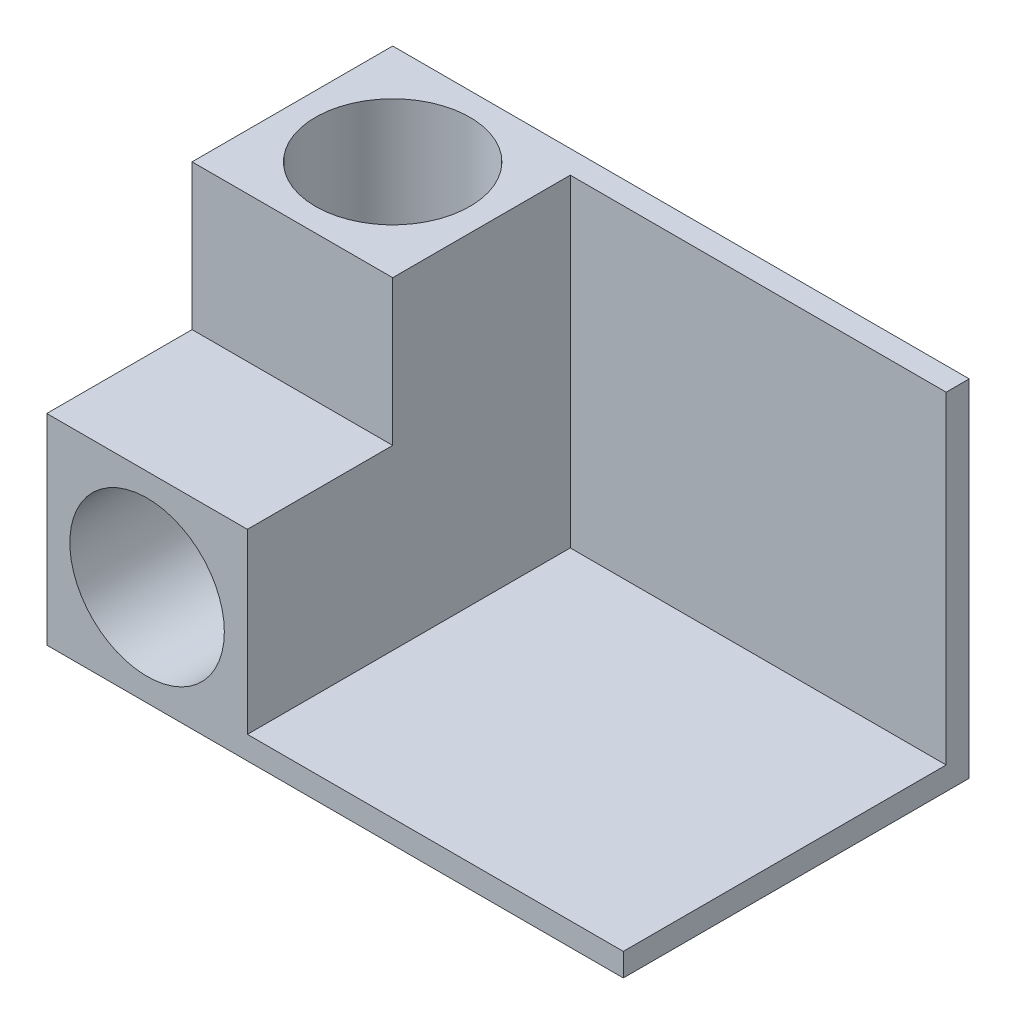
ISO-10303-21;
HEADER;
FILE_DESCRIPTION(('STEP AP214'),'2;1');
FILE_NAME('part.step','',(''),(''),'','','');
FILE_SCHEMA(('AUTOMOTIVE_DESIGN { 1 0 10303 214 1 1 1 1 }'));
ENDSEC;
DATA;
#1=APPLICATION_CONTEXT('core data for automotive mechanical design processes');
#2=APPLICATION_PROTOCOL_DEFINITION('international standard','automotive_design',2000,#1);
#3=PRODUCT_CONTEXT('',#1,'mechanical');
#4=PRODUCT('Part','Part','',(#3));
#5=PRODUCT_RELATED_PRODUCT_CATEGORY('part','',(#4));
#6=PRODUCT_DEFINITION_FORMATION('','',#4);
#7=PRODUCT_DEFINITION_CONTEXT('part definition',#1,'design');
#8=PRODUCT_DEFINITION('design','',#6,#7);
#9=PRODUCT_DEFINITION_SHAPE('','',#8);
#10=(LENGTH_UNIT() NAMED_UNIT(*) SI_UNIT(.MILLI.,.METRE.));
#11=(NAMED_UNIT(*) PLANE_ANGLE_UNIT() SI_UNIT($,.RADIAN.));
#12=(NAMED_UNIT(*) SI_UNIT($,.STERADIAN.) SOLID_ANGLE_UNIT());
#13=UNCERTAINTY_MEASURE_WITH_UNIT(LENGTH_MEASURE(1.E-05),#10,'distance_accuracy_value','');
#14=(GEOMETRIC_REPRESENTATION_CONTEXT(3) GLOBAL_UNCERTAINTY_ASSIGNED_CONTEXT((#13)) GLOBAL_UNIT_ASSIGNED_CONTEXT((#10,
#11,#12)) REPRESENTATION_CONTEXT('',''));
#15=CARTESIAN_POINT('',(0.,0.,0.));
#16=DIRECTION('',(0.,0.,1.));
#17=DIRECTION('',(1.,0.,0.));
#18=AXIS2_PLACEMENT_3D('',#15,#16,#17);
#19=CARTESIAN_POINT('',(-65.2,56.,0.));
#20=DIRECTION('',(1.,0.,0.));
#21=DIRECTION('',(0.,0.,-1.));
#22=AXIS2_PLACEMENT_3D('',#19,#20,#21);
#23=PLANE('',#22);
#24=DIRECTION('',(0.,0.,-1.));
#25=VECTOR('',#24,1.);
#26=CARTESIAN_POINT('',(-65.2,30.8,0.));
#27=LINE('',#26,#25);
#28=CARTESIAN_POINT('',(-65.2,30.8,11.3201320132013));
#29=VERTEX_POINT('',#28);
#30=CARTESIAN_POINT('',(-65.2,30.8,-13.8798679867987));
#31=VERTEX_POINT('',#30);
#32=EDGE_CURVE('E154',#29,#31,#27,.T.);
#33=ORIENTED_EDGE('',*,*,#32,.F.);
#34=DIRECTION('',(0.,-1.,0.));
#35=VECTOR('',#34,1.);
#36=CARTESIAN_POINT('',(-65.2,56.,11.3201320132013));
#37=LINE('',#36,#35);
#38=CARTESIAN_POINT('',(-65.2,0.,11.3201320132013));
#39=VERTEX_POINT('',#38);
#40=EDGE_CURVE('E119',#29,#39,#37,.T.);
#41=ORIENTED_EDGE('',*,*,#40,.T.);
#42=DIRECTION('',(0.,0.,1.));
#43=VECTOR('',#42,1.);
#44=CARTESIAN_POINT('',(-65.2,0.,0.));
#45=LINE('',#44,#43);
#46=CARTESIAN_POINT('',(-65.2,0.,-44.6798679867987));
#47=VERTEX_POINT('',#46);
#48=EDGE_CURVE('E123',#47,#39,#45,.T.);
#49=ORIENTED_EDGE('',*,*,#48,.F.);
#50=DIRECTION('',(0.,-1.,0.));
#51=VECTOR('',#50,1.);
#52=CARTESIAN_POINT('',(-65.2,56.,-44.6798679867987));
#53=LINE('',#52,#51);
#54=CARTESIAN_POINT('',(-65.2,56.,-44.6798679867987));
#55=VERTEX_POINT('',#54);
#56=EDGE_CURVE('E43',#55,#47,#53,.T.);
#57=ORIENTED_EDGE('',*,*,#56,.F.);
#58=DIRECTION('',(0.,0.,1.));
#59=VECTOR('',#58,1.);
#60=CARTESIAN_POINT('',(-65.2,56.,0.));
#61=LINE('',#60,#59);
#62=CARTESIAN_POINT('',(-65.2,56.,-13.8798679867987));
#63=VERTEX_POINT('',#62);
#64=EDGE_CURVE('E107',#55,#63,#61,.T.);
#65=ORIENTED_EDGE('',*,*,#64,.T.);
#66=DIRECTION('',(0.,1.,0.));
#67=VECTOR('',#66,1.);
#68=CARTESIAN_POINT('',(-65.2,56.,-13.8798679867987));
#69=LINE('',#68,#67);
#70=EDGE_CURVE('E49',#31,#63,#69,.T.);
#71=ORIENTED_EDGE('',*,*,#70,.F.);
#72=EDGE_LOOP('',(#33,#41,#49,#57,#65,#71));
#73=FACE_BOUND('',#72,.T.);
#74=ADVANCED_FACE('F35',(#73),#23,.T.);
#75=CARTESIAN_POINT('',(0.,56.,-44.6798679867987));
#76=DIRECTION('',(0.,0.,-1.));
#77=DIRECTION('',(-1.,0.,0.));
#78=AXIS2_PLACEMENT_3D('',#75,#76,#77);
#79=PLANE('',#78);
#80=DIRECTION('',(1.,0.,0.));
#81=VECTOR('',#80,1.);
#82=CARTESIAN_POINT('',(0.,0.,-44.6798679867987));
#83=LINE('',#82,#81);
#84=CARTESIAN_POINT('',(0.,0.,-44.6798679867987));
#85=VERTEX_POINT('',#84);
#86=EDGE_CURVE('E80',#47,#85,#83,.T.);
#87=ORIENTED_EDGE('',*,*,#86,.T.);
#88=DIRECTION('',(0.,-1.,0.));
#89=VECTOR('',#88,1.);
#90=CARTESIAN_POINT('',(0.,56.,-44.6798679867987));
#91=LINE('',#90,#89);
#92=CARTESIAN_POINT('',(0.,56.,-44.6798679867987));
#93=VERTEX_POINT('',#92);
#94=EDGE_CURVE('E94',#93,#85,#91,.T.);
#95=ORIENTED_EDGE('',*,*,#94,.F.);
#96=DIRECTION('',(1.,0.,0.));
#97=VECTOR('',#96,1.);
#98=CARTESIAN_POINT('',(0.,56.,-44.6798679867987));
#99=LINE('',#98,#97);
#100=EDGE_CURVE('E100',#55,#93,#99,.T.);
#101=ORIENTED_EDGE('',*,*,#100,.F.);
#102=ORIENTED_EDGE('',*,*,#56,.T.);
#103=EDGE_LOOP('',(#87,#95,#101,#102));
#104=FACE_BOUND('',#103,.T.);
#105=ADVANCED_FACE('F110',(#104),#79,.F.);
#106=CARTESIAN_POINT('',(0.,56.,0.));
#107=DIRECTION('',(-1.,0.,0.));
#108=DIRECTION('',(0.,0.,1.));
#109=AXIS2_PLACEMENT_3D('',#106,#107,#108);
#110=PLANE('',#109);
#111=ORIENTED_EDGE('',*,*,#94,.T.);
#112=DIRECTION('',(0.,0.,-1.));
#113=VECTOR('',#112,1.);
#114=CARTESIAN_POINT('',(0.,0.,-48.6798679867987));
#115=LINE('',#114,#113);
#116=CARTESIAN_POINT('',(0.,0.,11.3201320132013));
#117=VERTEX_POINT('',#116);
#118=EDGE_CURVE('E72',#117,#85,#115,.T.);
#119=ORIENTED_EDGE('',*,*,#118,.F.);
#120=DIRECTION('',(0.,1.,0.));
#121=VECTOR('',#120,1.);
#122=CARTESIAN_POINT('',(0.,-4.,11.3201320132013));
#123=LINE('',#122,#121);
#124=CARTESIAN_POINT('',(0.,-4.,11.3201320132013));
#125=VERTEX_POINT('',#124);
#126=EDGE_CURVE('E128',#125,#117,#123,.T.);
#127=ORIENTED_EDGE('',*,*,#126,.F.);
#128=DIRECTION('',(0.,0.,-1.));
#129=VECTOR('',#128,1.);
#130=CARTESIAN_POINT('',(0.,-4.,-48.6798679867987));
#131=LINE('',#130,#129);
#132=CARTESIAN_POINT('',(0.,-4.,-48.6798679867987));
#133=VERTEX_POINT('',#132);
#134=EDGE_CURVE('E139',#125,#133,#131,.T.);
#135=ORIENTED_EDGE('',*,*,#134,.T.);
#136=DIRECTION('',(0.,-1.,0.));
#137=VECTOR('',#136,1.);
#138=CARTESIAN_POINT('',(0.,56.,-48.6798679867987));
#139=LINE('',#138,#137);
#140=CARTESIAN_POINT('',(0.,56.,-48.6798679867987));
#141=VERTEX_POINT('',#140);
#142=EDGE_CURVE('E97',#141,#133,#139,.T.);
#143=ORIENTED_EDGE('',*,*,#142,.F.);
#144=DIRECTION('',(0.,0.,-1.));
#145=VECTOR('',#144,1.);
#146=CARTESIAN_POINT('',(0.,56.,0.));
#147=LINE('',#146,#145);
#148=EDGE_CURVE('E90',#93,#141,#147,.T.);
#149=ORIENTED_EDGE('',*,*,#148,.F.);
#150=EDGE_LOOP('',(#111,#119,#127,#135,#143,#149));
#151=FACE_BOUND('',#150,.T.);
#152=ADVANCED_FACE('F92',(#151),#110,.F.);
#153=CARTESIAN_POINT('',(0.,56.,-48.6798679867987));
#154=DIRECTION('',(0.,0.,1.));
#155=DIRECTION('',(1.,0.,0.));
#156=AXIS2_PLACEMENT_3D('',#153,#154,#155);
#157=PLANE('',#156);
#158=ORIENTED_EDGE('',*,*,#142,.T.);
#159=DIRECTION('',(-1.,0.,0.));
#160=VECTOR('',#159,1.);
#161=CARTESIAN_POINT('',(0.,-4.,-48.6798679867987));
#162=LINE('',#161,#160);
#163=CARTESIAN_POINT('',(-100.,-4.,-48.6798679867987));
#164=VERTEX_POINT('',#163);
#165=EDGE_CURVE('E147',#133,#164,#162,.T.);
#166=ORIENTED_EDGE('',*,*,#165,.T.);
#167=DIRECTION('',(0.,-1.,0.));
#168=VECTOR('',#167,1.);
#169=CARTESIAN_POINT('',(-100.,56.,-48.6798679867987));
#170=LINE('',#169,#168);
#171=CARTESIAN_POINT('',(-100.,56.,-48.6798679867987));
#172=VERTEX_POINT('',#171);
#173=EDGE_CURVE('E112',#172,#164,#170,.T.);
#174=ORIENTED_EDGE('',*,*,#173,.F.);
#175=DIRECTION('',(-1.,0.,0.));
#176=VECTOR('',#175,1.);
#177=CARTESIAN_POINT('',(0.,56.,-48.6798679867987));
#178=LINE('',#177,#176);
#179=EDGE_CURVE('E99',#141,#172,#178,.T.);
#180=ORIENTED_EDGE('',*,*,#179,.F.);
#181=EDGE_LOOP('',(#158,#166,#174,#180));
#182=FACE_BOUND('',#181,.T.);
#183=ADVANCED_FACE('F210',(#182),#157,.F.);
#184=CARTESIAN_POINT('',(-100.,56.,0.));
#185=DIRECTION('',(-1.,0.,0.));
#186=DIRECTION('',(0.,0.,1.));
#187=AXIS2_PLACEMENT_3D('',#184,#185,#186);
#188=PLANE('',#187);
#189=DIRECTION('',(0.,0.,1.));
#190=VECTOR('',#189,1.);
#191=CARTESIAN_POINT('',(-100.,30.8,11.3201320132013));
#192=LINE('',#191,#190);
#193=CARTESIAN_POINT('',(-100.,30.8,-13.8798679867987));
#194=VERTEX_POINT('',#193);
#195=CARTESIAN_POINT('',(-100.,30.8,11.3201320132013));
#196=VERTEX_POINT('',#195);
#197=EDGE_CURVE('E164',#194,#196,#192,.T.);
#198=ORIENTED_EDGE('',*,*,#197,.F.);
#199=DIRECTION('',(0.,-1.,0.));
#200=VECTOR('',#199,1.);
#201=CARTESIAN_POINT('',(-100.,56.,-13.8798679867987));
#202=LINE('',#201,#200);
#203=CARTESIAN_POINT('',(-100.,56.,-13.8798679867987));
#204=VERTEX_POINT('',#203);
#205=EDGE_CURVE('E169',#204,#194,#202,.T.);
#206=ORIENTED_EDGE('',*,*,#205,.F.);
#207=DIRECTION('',(0.,0.,-1.));
#208=VECTOR('',#207,1.);
#209=CARTESIAN_POINT('',(-100.,56.,0.));
#210=LINE('',#209,#208);
#211=EDGE_CURVE('E58',#204,#172,#210,.T.);
#212=ORIENTED_EDGE('',*,*,#211,.T.);
#213=ORIENTED_EDGE('',*,*,#173,.T.);
#214=DIRECTION('',(0.,0.,1.));
#215=VECTOR('',#214,1.);
#216=CARTESIAN_POINT('',(-100.,-4.,-48.6798679867987));
#217=LINE('',#216,#215);
#218=CARTESIAN_POINT('',(-100.,-4.,11.3201320132013));
#219=VERTEX_POINT('',#218);
#220=EDGE_CURVE('E144',#164,#219,#217,.T.);
#221=ORIENTED_EDGE('',*,*,#220,.T.);
#222=DIRECTION('',(0.,-1.,0.));
#223=VECTOR('',#222,1.);
#224=CARTESIAN_POINT('',(-100.,56.,11.3201320132013));
#225=LINE('',#224,#223);
#226=EDGE_CURVE('E116',#196,#219,#225,.T.);
#227=ORIENTED_EDGE('',*,*,#226,.F.);
#228=EDGE_LOOP('',(#198,#206,#212,#213,#221,#227));
#229=FACE_BOUND('',#228,.T.);
#230=ADVANCED_FACE('F179',(#229),#188,.T.);
#231=CARTESIAN_POINT('',(-82.6,56.,-31.2798679867987));
#232=DIRECTION('',(0.,-1.,0.));
#233=DIRECTION('',(0.,0.,-1.));
#234=AXIS2_PLACEMENT_3D('',#231,#232,#233);
#235=CYLINDRICAL_SURFACE('',#234,13.4);
#236=CARTESIAN_POINT('',(-82.6,56.,-31.2798679867987));
#237=DIRECTION('',(0.,1.,0.));
#238=DIRECTION('',(0.,0.,1.));
#239=AXIS2_PLACEMENT_3D('',#236,#237,#238);
#240=CIRCLE('',#239,13.4);
#241=CARTESIAN_POINT('',(-82.6,56.,-17.8798679867987));
#242=VERTEX_POINT('',#241);
#243=EDGE_CURVE('E122',#242,#242,#240,.T.);
#244=ORIENTED_EDGE('',*,*,#243,.T.);
#245=EDGE_LOOP('',(#244));
#246=FACE_BOUND('',#245,.T.);
#247=CARTESIAN_POINT('',(-82.6,0.,-31.2798679867987));
#248=DIRECTION('',(0.,1.,0.));
#249=DIRECTION('',(0.,0.,1.));
#250=AXIS2_PLACEMENT_3D('',#247,#248,#249);
#251=CIRCLE('',#250,13.4);
#252=CARTESIAN_POINT('',(-82.6,0.,-17.8798679867987));
#253=VERTEX_POINT('',#252);
#254=EDGE_CURVE('E125',#253,#253,#251,.T.);
#255=ORIENTED_EDGE('',*,*,#254,.F.);
#256=EDGE_LOOP('',(#255));
#257=FACE_BOUND('',#256,.T.);
#258=ADVANCED_FACE('F37',(#246,#257),#235,.F.);
#259=CARTESIAN_POINT('',(0.,56.,11.3201320132013));
#260=DIRECTION('',(0.,0.,1.));
#261=DIRECTION('',(1.,0.,0.));
#262=AXIS2_PLACEMENT_3D('',#259,#260,#261);
#263=PLANE('',#262);
#264=DIRECTION('',(-1.,0.,0.));
#265=VECTOR('',#264,1.);
#266=CARTESIAN_POINT('',(-48.8,30.8,11.3201320132013));
#267=LINE('',#266,#265);
#268=EDGE_CURVE('E160',#29,#196,#267,.T.);
#269=ORIENTED_EDGE('',*,*,#268,.T.);
#270=ORIENTED_EDGE('',*,*,#226,.T.);
#271=DIRECTION('',(1.,0.,0.));
#272=VECTOR('',#271,1.);
#273=CARTESIAN_POINT('',(0.,-4.,11.3201320132013));
#274=LINE('',#273,#272);
#275=EDGE_CURVE('E136',#219,#125,#274,.T.);
#276=ORIENTED_EDGE('',*,*,#275,.T.);
#277=ORIENTED_EDGE('',*,*,#126,.T.);
#278=DIRECTION('',(1.,0.,0.));
#279=VECTOR('',#278,1.);
#280=CARTESIAN_POINT('',(0.,0.,11.3201320132013));
#281=LINE('',#280,#279);
#282=EDGE_CURVE('E137',#39,#117,#281,.T.);
#283=ORIENTED_EDGE('',*,*,#282,.F.);
#284=ORIENTED_EDGE('',*,*,#40,.F.);
#285=EDGE_LOOP('',(#269,#270,#276,#277,#283,#284));
#286=FACE_BOUND('',#285,.T.);
#287=CARTESIAN_POINT('',(-82.6,13.4,11.3201320132013));
#288=DIRECTION('',(0.,0.,1.));
#289=DIRECTION('',(1.,0.,0.));
#290=AXIS2_PLACEMENT_3D('',#287,#288,#289);
#291=CIRCLE('',#290,13.4);
#292=CARTESIAN_POINT('',(-69.2,13.4,11.3201320132013));
#293=VERTEX_POINT('',#292);
#294=EDGE_CURVE('E151',#293,#293,#291,.T.);
#295=ORIENTED_EDGE('',*,*,#294,.F.);
#296=EDGE_LOOP('',(#295));
#297=FACE_BOUND('',#296,.T.);
#298=ADVANCED_FACE('F188',(#286,#297),#263,.T.);
#299=CARTESIAN_POINT('',(0.,56.,0.));
#300=DIRECTION('',(0.,1.,0.));
#301=DIRECTION('',(0.,0.,1.));
#302=AXIS2_PLACEMENT_3D('',#299,#300,#301);
#303=PLANE('',#302);
#304=DIRECTION('',(-1.,0.,0.));
#305=VECTOR('',#304,1.);
#306=CARTESIAN_POINT('',(0.,56.,-13.8798679867987));
#307=LINE('',#306,#305);
#308=EDGE_CURVE('E11',#63,#204,#307,.T.);
#309=ORIENTED_EDGE('',*,*,#308,.F.);
#310=ORIENTED_EDGE('',*,*,#64,.F.);
#311=ORIENTED_EDGE('',*,*,#100,.T.);
#312=ORIENTED_EDGE('',*,*,#148,.T.);
#313=ORIENTED_EDGE('',*,*,#179,.T.);
#314=ORIENTED_EDGE('',*,*,#211,.F.);
#315=EDGE_LOOP('',(#309,#310,#311,#312,#313,#314));
#316=FACE_BOUND('',#315,.T.);
#317=ORIENTED_EDGE('',*,*,#243,.F.);
#318=EDGE_LOOP('',(#317));
#319=FACE_BOUND('',#318,.T.);
#320=ADVANCED_FACE('F104',(#316,#319),#303,.T.);
#321=CARTESIAN_POINT('',(0.,-4.,0.));
#322=DIRECTION('',(0.,-1.,0.));
#323=DIRECTION('',(0.,0.,-1.));
#324=AXIS2_PLACEMENT_3D('',#321,#322,#323);
#325=PLANE('',#324);
#326=ORIENTED_EDGE('',*,*,#134,.F.);
#327=ORIENTED_EDGE('',*,*,#275,.F.);
#328=ORIENTED_EDGE('',*,*,#220,.F.);
#329=ORIENTED_EDGE('',*,*,#165,.F.);
#330=EDGE_LOOP('',(#326,#327,#328,#329));
#331=FACE_BOUND('',#330,.T.);
#332=ADVANCED_FACE('F204',(#331),#325,.T.);
#333=CARTESIAN_POINT('',(0.,0.,0.));
#334=DIRECTION('',(0.,-1.,0.));
#335=DIRECTION('',(0.,0.,-1.));
#336=AXIS2_PLACEMENT_3D('',#333,#334,#335);
#337=PLANE('',#336);
#338=ORIENTED_EDGE('',*,*,#86,.F.);
#339=ORIENTED_EDGE('',*,*,#48,.T.);
#340=ORIENTED_EDGE('',*,*,#282,.T.);
#341=ORIENTED_EDGE('',*,*,#118,.T.);
#342=EDGE_LOOP('',(#338,#339,#340,#341));
#343=FACE_BOUND('',#342,.T.);
#344=ADVANCED_FACE('F196',(#343),#337,.F.);
#345=ORIENTED_EDGE('',*,*,#254,.T.);
#346=EDGE_LOOP('',(#345));
#347=FACE_BOUND('',#346,.T.);
#348=ADVANCED_FACE('F262',(#347),#337,.F.);
#349=CARTESIAN_POINT('',(-82.6,13.4,-13.8798679867987));
#350=DIRECTION('',(0.,0.,1.));
#351=DIRECTION('',(1.,0.,0.));
#352=AXIS2_PLACEMENT_3D('',#349,#350,#351);
#353=CYLINDRICAL_SURFACE('',#352,13.4);
#354=CARTESIAN_POINT('',(-82.6,13.4,-13.8798679867987));
#355=DIRECTION('',(0.,0.,1.));
#356=DIRECTION('',(1.,0.,0.));
#357=AXIS2_PLACEMENT_3D('',#354,#355,#356);
#358=CIRCLE('',#357,13.4);
#359=CARTESIAN_POINT('',(-69.2,13.4,-13.8798679867987));
#360=VERTEX_POINT('',#359);
#361=EDGE_CURVE('E141',#360,#360,#358,.T.);
#362=ORIENTED_EDGE('',*,*,#361,.F.);
#363=EDGE_LOOP('',(#362));
#364=FACE_BOUND('',#363,.T.);
#365=ORIENTED_EDGE('',*,*,#294,.T.);
#366=EDGE_LOOP('',(#365));
#367=FACE_BOUND('',#366,.T.);
#368=ADVANCED_FACE('F271',(#364,#367),#353,.F.);
#369=CARTESIAN_POINT('',(-82.6,13.4,-13.8798679867987));
#370=DIRECTION('',(0.,0.,1.));
#371=DIRECTION('',(1.,0.,0.));
#372=AXIS2_PLACEMENT_3D('',#369,#370,#371);
#373=PLANE('',#372);
#374=ORIENTED_EDGE('',*,*,#361,.T.);
#375=EDGE_LOOP('',(#374));
#376=FACE_BOUND('',#375,.T.);
#377=ADVANCED_FACE('F280',(#376),#373,.T.);
#378=CARTESIAN_POINT('',(-48.8,30.8,11.3201320132013));
#379=DIRECTION('',(0.,-1.,0.));
#380=DIRECTION('',(0.,0.,-1.));
#381=AXIS2_PLACEMENT_3D('',#378,#379,#380);
#382=PLANE('',#381);
#383=ORIENTED_EDGE('',*,*,#32,.T.);
#384=DIRECTION('',(-1.,0.,0.));
#385=VECTOR('',#384,1.);
#386=CARTESIAN_POINT('',(-48.8,30.8,-13.8798679867987));
#387=LINE('',#386,#385);
#388=EDGE_CURVE('E161',#31,#194,#387,.T.);
#389=ORIENTED_EDGE('',*,*,#388,.T.);
#390=ORIENTED_EDGE('',*,*,#197,.T.);
#391=ORIENTED_EDGE('',*,*,#268,.F.);
#392=EDGE_LOOP('',(#383,#389,#390,#391));
#393=FACE_BOUND('',#392,.T.);
#394=ADVANCED_FACE('F182',(#393),#382,.F.);
#395=CARTESIAN_POINT('',(-48.8,56.,-13.8798679867987));
#396=DIRECTION('',(0.,0.,-1.));
#397=DIRECTION('',(0.,1.,0.));
#398=AXIS2_PLACEMENT_3D('',#395,#396,#397);
#399=PLANE('',#398);
#400=ORIENTED_EDGE('',*,*,#70,.T.);
#401=ORIENTED_EDGE('',*,*,#308,.T.);
#402=ORIENTED_EDGE('',*,*,#205,.T.);
#403=ORIENTED_EDGE('',*,*,#388,.F.);
#404=EDGE_LOOP('',(#400,#401,#402,#403));
#405=FACE_BOUND('',#404,.T.);
#406=ADVANCED_FACE('F173',(#405),#399,.F.);
#407=CLOSED_SHELL('',(#74,#105,#152,#183,#230,#258,#298,#320,#332,#344,#348,#368,#377,#394,#406));
#408=MANIFOLD_SOLID_BREP('B2',#407);
#409=ADVANCED_BREP_SHAPE_REPRESENTATION('',(#18,#408),#14);
#410=SHAPE_DEFINITION_REPRESENTATION(#9,#409);
ENDSEC;
END-ISO-10303-21;
